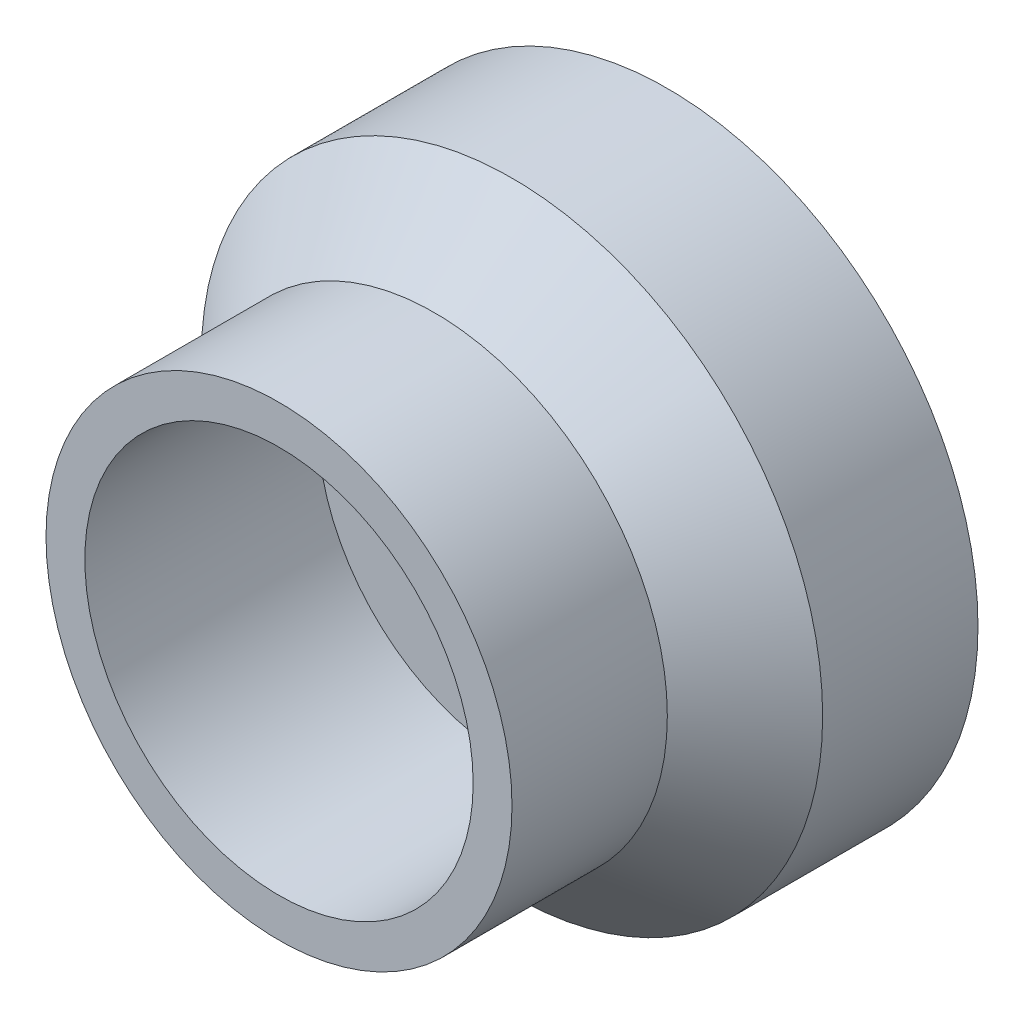
ISO-10303-21;
HEADER;
FILE_DESCRIPTION(('STEP AP214'),'2;1');
FILE_NAME('part.step','',(''),(''),'','','');
FILE_SCHEMA(('AUTOMOTIVE_DESIGN { 1 0 10303 214 1 1 1 1 }'));
ENDSEC;
DATA;
#1=APPLICATION_CONTEXT('core data for automotive mechanical design processes');
#2=APPLICATION_PROTOCOL_DEFINITION('international standard','automotive_design',2000,#1);
#3=PRODUCT_CONTEXT('',#1,'mechanical');
#4=PRODUCT('Part','Part','',(#3));
#5=PRODUCT_RELATED_PRODUCT_CATEGORY('part','',(#4));
#6=PRODUCT_DEFINITION_FORMATION('','',#4);
#7=PRODUCT_DEFINITION_CONTEXT('part definition',#1,'design');
#8=PRODUCT_DEFINITION('design','',#6,#7);
#9=PRODUCT_DEFINITION_SHAPE('','',#8);
#10=(LENGTH_UNIT() NAMED_UNIT(*) SI_UNIT(.MILLI.,.METRE.));
#11=(NAMED_UNIT(*) PLANE_ANGLE_UNIT() SI_UNIT($,.RADIAN.));
#12=(NAMED_UNIT(*) SI_UNIT($,.STERADIAN.) SOLID_ANGLE_UNIT());
#13=UNCERTAINTY_MEASURE_WITH_UNIT(LENGTH_MEASURE(1.E-05),#10,'distance_accuracy_value','');
#14=(GEOMETRIC_REPRESENTATION_CONTEXT(3) GLOBAL_UNCERTAINTY_ASSIGNED_CONTEXT((#13)) GLOBAL_UNIT_ASSIGNED_CONTEXT((#10,
#11,#12)) REPRESENTATION_CONTEXT('',''));
#15=CARTESIAN_POINT('',(0.,0.,0.));
#16=DIRECTION('',(0.,0.,1.));
#17=DIRECTION('',(1.,0.,0.));
#18=AXIS2_PLACEMENT_3D('',#15,#16,#17);
#19=CARTESIAN_POINT('',(0.,0.,15.));
#20=DIRECTION('',(0.,0.,-1.));
#21=DIRECTION('',(-1.,0.,0.));
#22=AXIS2_PLACEMENT_3D('',#19,#20,#21);
#23=CYLINDRICAL_SURFACE('',#22,12.5);
#24=CARTESIAN_POINT('',(0.,0.,15.));
#25=DIRECTION('',(0.,0.,1.));
#26=DIRECTION('',(1.,0.,0.));
#27=AXIS2_PLACEMENT_3D('',#24,#25,#26);
#28=CIRCLE('',#27,12.5);
#29=CARTESIAN_POINT('',(12.5,0.,15.));
#30=VERTEX_POINT('',#29);
#31=EDGE_CURVE('E47',#30,#30,#28,.T.);
#32=ORIENTED_EDGE('',*,*,#31,.T.);
#33=EDGE_LOOP('',(#32));
#34=FACE_BOUND('',#33,.T.);
#35=CARTESIAN_POINT('',(0.,0.,0.));
#36=DIRECTION('',(0.,0.,1.));
#37=DIRECTION('',(1.,0.,0.));
#38=AXIS2_PLACEMENT_3D('',#35,#36,#37);
#39=CIRCLE('',#38,12.5);
#40=CARTESIAN_POINT('',(12.5,0.,0.));
#41=VERTEX_POINT('',#40);
#42=EDGE_CURVE('E52',#41,#41,#39,.T.);
#43=ORIENTED_EDGE('',*,*,#42,.F.);
#44=EDGE_LOOP('',(#43));
#45=FACE_BOUND('',#44,.T.);
#46=ADVANCED_FACE('F35',(#34,#45),#23,.F.);
#47=CARTESIAN_POINT('',(0.,0.,15.));
#48=DIRECTION('',(0.,0.,-1.));
#49=DIRECTION('',(-1.,0.,0.));
#50=AXIS2_PLACEMENT_3D('',#47,#48,#49);
#51=CYLINDRICAL_SURFACE('',#50,15.);
#52=CARTESIAN_POINT('',(0.,0.,5.00000000000003));
#53=DIRECTION('',(0.,0.,1.));
#54=DIRECTION('',(1.,0.,0.));
#55=AXIS2_PLACEMENT_3D('',#52,#53,#54);
#56=CIRCLE('',#55,15.);
#57=CARTESIAN_POINT('',(15.,0.,5.00000000000003));
#58=VERTEX_POINT('',#57);
#59=EDGE_CURVE('E10',#58,#58,#56,.T.);
#60=ORIENTED_EDGE('',*,*,#59,.T.);
#61=EDGE_LOOP('',(#60));
#62=FACE_BOUND('',#61,.T.);
#63=CARTESIAN_POINT('',(0.,0.,15.));
#64=DIRECTION('',(0.,0.,1.));
#65=DIRECTION('',(1.,0.,0.));
#66=AXIS2_PLACEMENT_3D('',#63,#64,#65);
#67=CIRCLE('',#66,15.);
#68=CARTESIAN_POINT('',(15.,0.,15.));
#69=VERTEX_POINT('',#68);
#70=EDGE_CURVE('E43',#69,#69,#67,.T.);
#71=ORIENTED_EDGE('',*,*,#70,.F.);
#72=EDGE_LOOP('',(#71));
#73=FACE_BOUND('',#72,.T.);
#74=ADVANCED_FACE('F84',(#62,#73),#51,.T.);
#75=CARTESIAN_POINT('',(0.,0.,15.));
#76=DIRECTION('',(0.,0.,1.));
#77=DIRECTION('',(1.,0.,0.));
#78=AXIS2_PLACEMENT_3D('',#75,#76,#77);
#79=PLANE('',#78);
#80=ORIENTED_EDGE('',*,*,#31,.F.);
#81=EDGE_LOOP('',(#80));
#82=FACE_BOUND('',#81,.T.);
#83=ORIENTED_EDGE('',*,*,#70,.T.);
#84=EDGE_LOOP('',(#83));
#85=FACE_BOUND('',#84,.T.);
#86=ADVANCED_FACE('F79',(#82,#85),#79,.T.);
#87=CARTESIAN_POINT('',(0.,0.,-10.));
#88=DIRECTION('',(0.,0.,1.));
#89=DIRECTION('',(1.,0.,0.));
#90=AXIS2_PLACEMENT_3D('',#87,#88,#89);
#91=PLANE('',#90);
#92=CARTESIAN_POINT('',(0.,0.,-10.));
#93=DIRECTION('',(0.,0.,1.));
#94=DIRECTION('',(1.,0.,0.));
#95=AXIS2_PLACEMENT_3D('',#92,#93,#94);
#96=CIRCLE('',#95,20.);
#97=CARTESIAN_POINT('',(20.,0.,-10.));
#98=VERTEX_POINT('',#97);
#99=EDGE_CURVE('E56',#98,#98,#96,.T.);
#100=ORIENTED_EDGE('',*,*,#99,.F.);
#101=EDGE_LOOP('',(#100));
#102=FACE_BOUND('',#101,.T.);
#103=ADVANCED_FACE('F72',(#102),#91,.F.);
#104=CARTESIAN_POINT('',(0.,0.,-10.));
#105=DIRECTION('',(0.,0.,1.));
#106=DIRECTION('',(1.,0.,0.));
#107=AXIS2_PLACEMENT_3D('',#104,#105,#106);
#108=CYLINDRICAL_SURFACE('',#107,20.);
#109=ORIENTED_EDGE('',*,*,#99,.T.);
#110=EDGE_LOOP('',(#109));
#111=FACE_BOUND('',#110,.T.);
#112=CARTESIAN_POINT('',(0.,0.,0.));
#113=DIRECTION('',(0.,0.,1.));
#114=DIRECTION('',(1.,0.,0.));
#115=AXIS2_PLACEMENT_3D('',#112,#113,#114);
#116=CIRCLE('',#115,20.);
#117=CARTESIAN_POINT('',(20.,0.,0.));
#118=VERTEX_POINT('',#117);
#119=EDGE_CURVE('E60',#118,#118,#116,.T.);
#120=ORIENTED_EDGE('',*,*,#119,.F.);
#121=EDGE_LOOP('',(#120));
#122=FACE_BOUND('',#121,.T.);
#123=ADVANCED_FACE('F69',(#111,#122),#108,.T.);
#124=CARTESIAN_POINT('',(0.,0.,0.));
#125=DIRECTION('',(0.,0.,1.));
#126=DIRECTION('',(1.,0.,0.));
#127=AXIS2_PLACEMENT_3D('',#124,#125,#126);
#128=PLANE('',#127);
#129=ORIENTED_EDGE('',*,*,#42,.T.);
#130=EDGE_LOOP('',(#129));
#131=FACE_BOUND('',#130,.T.);
#132=ADVANCED_FACE('F71',(#131),#128,.T.);
#133=CARTESIAN_POINT('',(0.,0.,5.00000000000003));
#134=DIRECTION('',(0.,0.,-1.));
#135=DIRECTION('',(-1.,0.,0.));
#136=AXIS2_PLACEMENT_3D('',#133,#134,#135);
#137=CONICAL_SURFACE('',#136,15.,0.785398163397445);
#138=ORIENTED_EDGE('',*,*,#119,.T.);
#139=EDGE_LOOP('',(#138));
#140=FACE_BOUND('',#139,.T.);
#141=ORIENTED_EDGE('',*,*,#59,.F.);
#142=EDGE_LOOP('',(#141));
#143=FACE_BOUND('',#142,.T.);
#144=ADVANCED_FACE('F38',(#140,#143),#137,.T.);
#145=CLOSED_SHELL('',(#46,#74,#86,#103,#123,#132,#144));
#146=MANIFOLD_SOLID_BREP('B2',#145);
#147=ADVANCED_BREP_SHAPE_REPRESENTATION('',(#18,#146),#14);
#148=SHAPE_DEFINITION_REPRESENTATION(#9,#147);
ENDSEC;
END-ISO-10303-21;
